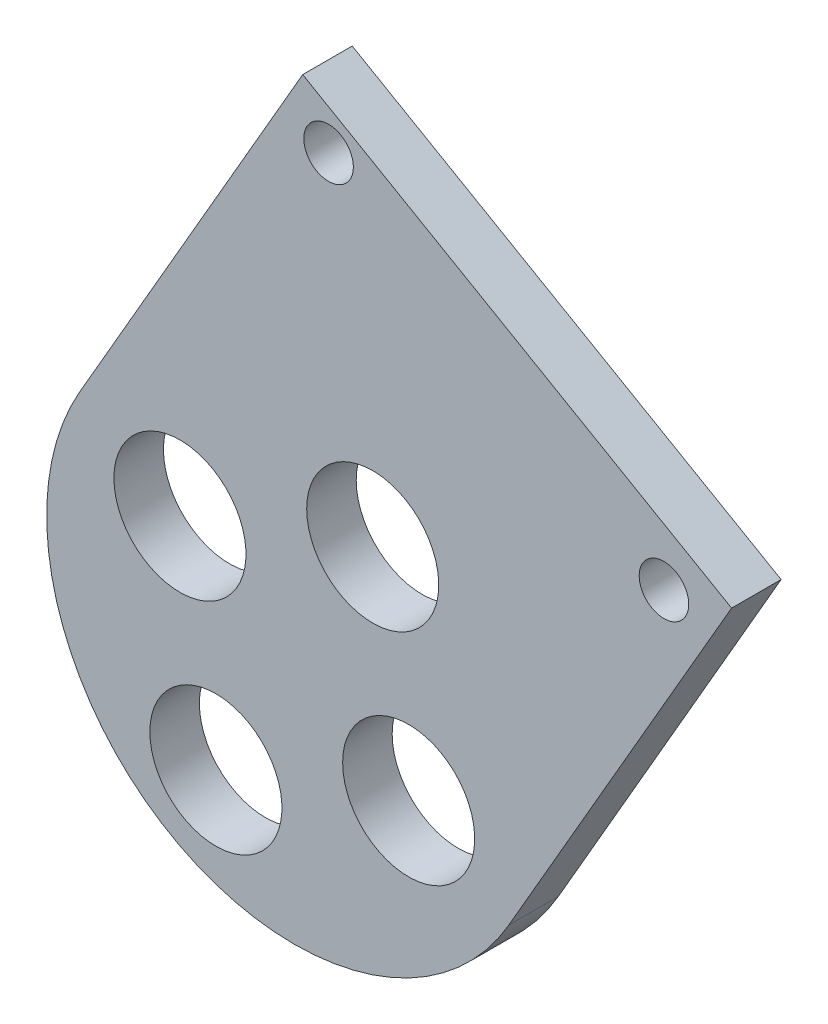
ISO-10303-21;
HEADER;
FILE_DESCRIPTION(('STEP AP214'),'2;1');
FILE_NAME('part.step','',(''),(''),'','','');
FILE_SCHEMA(('AUTOMOTIVE_DESIGN { 1 0 10303 214 1 1 1 1 }'));
ENDSEC;
DATA;
#1=APPLICATION_CONTEXT('core data for automotive mechanical design processes');
#2=APPLICATION_PROTOCOL_DEFINITION('international standard','automotive_design',2000,#1);
#3=PRODUCT_CONTEXT('',#1,'mechanical');
#4=PRODUCT('Part','Part','',(#3));
#5=PRODUCT_RELATED_PRODUCT_CATEGORY('part','',(#4));
#6=PRODUCT_DEFINITION_FORMATION('','',#4);
#7=PRODUCT_DEFINITION_CONTEXT('part definition',#1,'design');
#8=PRODUCT_DEFINITION('design','',#6,#7);
#9=PRODUCT_DEFINITION_SHAPE('','',#8);
#10=(LENGTH_UNIT() NAMED_UNIT(*) SI_UNIT(.MILLI.,.METRE.));
#11=(NAMED_UNIT(*) PLANE_ANGLE_UNIT() SI_UNIT($,.RADIAN.));
#12=(NAMED_UNIT(*) SI_UNIT($,.STERADIAN.) SOLID_ANGLE_UNIT());
#13=UNCERTAINTY_MEASURE_WITH_UNIT(LENGTH_MEASURE(1.E-05),#10,'distance_accuracy_value','');
#14=(GEOMETRIC_REPRESENTATION_CONTEXT(3) GLOBAL_UNCERTAINTY_ASSIGNED_CONTEXT((#13)) GLOBAL_UNIT_ASSIGNED_CONTEXT((#10,
#11,#12)) REPRESENTATION_CONTEXT('',''));
#15=CARTESIAN_POINT('',(0.,0.,0.));
#16=DIRECTION('',(0.,0.,1.));
#17=DIRECTION('',(1.,0.,0.));
#18=AXIS2_PLACEMENT_3D('',#15,#16,#17);
#19=CARTESIAN_POINT('',(-103.641833150661,426.936405577524,-401.357743681072));
#20=DIRECTION('',(0.,0.,-1.));
#21=DIRECTION('',(-1.,0.,0.));
#22=AXIS2_PLACEMENT_3D('',#19,#20,#21);
#23=PLANE('',#22);
#24=CARTESIAN_POINT('',(-145.250000000003,415.751632486842,-401.357743681072));
#25=DIRECTION('',(0.,0.,-1.));
#26=DIRECTION('',(-1.,0.,0.));
#27=AXIS2_PLACEMENT_3D('',#24,#25,#26);
#28=CIRCLE('',#27,4.);
#29=CARTESIAN_POINT('',(-149.250000000003,415.751632486842,-401.357743681072));
#30=VERTEX_POINT('',#29);
#31=EDGE_CURVE('E126',#30,#30,#28,.T.);
#32=ORIENTED_EDGE('',*,*,#31,.T.);
#33=EDGE_LOOP('',(#32));
#34=FACE_BOUND('',#33,.T.);
#35=CARTESIAN_POINT('',(-143.071796769728,403.524391150889,-401.357743681072));
#36=DIRECTION('',(0.,0.,-1.));
#37=DIRECTION('',(-1.,0.,0.));
#38=AXIS2_PLACEMENT_3D('',#35,#36,#37);
#39=CIRCLE('',#38,4.);
#40=CARTESIAN_POINT('',(-147.071796769728,403.524391150889,-401.357743681072));
#41=VERTEX_POINT('',#40);
#42=EDGE_CURVE('E123',#41,#41,#39,.T.);
#43=ORIENTED_EDGE('',*,*,#42,.T.);
#44=EDGE_LOOP('',(#43));
#45=FACE_BOUND('',#44,.T.);
#46=CARTESIAN_POINT('',(-156.928203230279,411.524391150889,-401.357743681072));
#47=DIRECTION('',(0.,0.,-1.));
#48=DIRECTION('',(-1.,0.,0.));
#49=AXIS2_PLACEMENT_3D('',#46,#47,#48);
#50=CIRCLE('',#49,4.);
#51=CARTESIAN_POINT('',(-160.928203230279,411.524391150889,-401.357743681072));
#52=VERTEX_POINT('',#51);
#53=EDGE_CURVE('E120',#52,#52,#50,.T.);
#54=ORIENTED_EDGE('',*,*,#53,.T.);
#55=EDGE_LOOP('',(#54));
#56=FACE_BOUND('',#55,.T.);
#57=CARTESIAN_POINT('',(-154.750000000003,399.297149814937,-401.357743681072));
#58=DIRECTION('',(0.,0.,-1.));
#59=DIRECTION('',(-1.,0.,0.));
#60=AXIS2_PLACEMENT_3D('',#57,#58,#59);
#61=CIRCLE('',#60,4.);
#62=CARTESIAN_POINT('',(-158.750000000003,399.297149814937,-401.357743681072));
#63=VERTEX_POINT('',#62);
#64=EDGE_CURVE('E117',#63,#63,#61,.T.);
#65=ORIENTED_EDGE('',*,*,#64,.T.);
#66=EDGE_LOOP('',(#65));
#67=FACE_BOUND('',#66,.T.);
#68=CARTESIAN_POINT('',(-147.923440835426,435.086734499588,-401.357743681072));
#69=DIRECTION('',(0.,0.,-1.));
#70=DIRECTION('',(-1.,0.,0.));
#71=AXIS2_PLACEMENT_3D('',#68,#69,#70);
#72=CIRCLE('',#71,1.5);
#73=CARTESIAN_POINT('',(-149.423440835426,435.086734499588,-401.357743681072));
#74=VERTEX_POINT('',#73);
#75=EDGE_CURVE('E91',#74,#74,#72,.T.);
#76=ORIENTED_EDGE('',*,*,#75,.T.);
#77=EDGE_LOOP('',(#76));
#78=FACE_BOUND('',#77,.T.);
#79=CARTESIAN_POINT('',(-127.607695154588,422.309000841716,-401.357743681072));
#80=DIRECTION('',(0.,0.,-1.));
#81=DIRECTION('',(-1.,0.,0.));
#82=AXIS2_PLACEMENT_3D('',#79,#80,#81);
#83=CIRCLE('',#82,1.5);
#84=CARTESIAN_POINT('',(-129.107695154588,422.309000841716,-401.357743681072));
#85=VERTEX_POINT('',#84);
#86=EDGE_CURVE('E129',#85,#85,#83,.T.);
#87=ORIENTED_EDGE('',*,*,#86,.T.);
#88=EDGE_LOOP('',(#87));
#89=FACE_BOUND('',#88,.T.);
#90=CARTESIAN_POINT('',(-150.000000000003,407.524391150889,-401.357743681072));
#91=DIRECTION('',(0.,0.,1.));
#92=DIRECTION('',(1.,0.,0.));
#93=AXIS2_PLACEMENT_3D('',#90,#91,#92);
#94=CIRCLE('',#93,15.);
#95=CARTESIAN_POINT('',(-137.009618943236,400.024391150889,-401.357743681072));
#96=VERTEX_POINT('',#95);
#97=CARTESIAN_POINT('',(-162.990381056769,415.024391150889,-401.357743681072));
#98=VERTEX_POINT('',#97);
#99=EDGE_CURVE('E20',#96,#98,#94,.F.);
#100=ORIENTED_EDGE('',*,*,#99,.F.);
#101=DIRECTION('',(-0.5,-0.866025403784438,0.));
#102=VECTOR('',#101,1.);
#103=CARTESIAN_POINT('',(-137.009618943236,400.024391150889,-401.357743681072));
#104=LINE('',#103,#102);
#105=CARTESIAN_POINT('',(-123.509618943236,423.407077053069,-401.357743681072));
#106=VERTEX_POINT('',#105);
#107=EDGE_CURVE('E67',#96,#106,#104,.F.);
#108=ORIENTED_EDGE('',*,*,#107,.T.);
#109=DIRECTION('',(0.866025403784438,-0.5,0.));
#110=VECTOR('',#109,1.);
#111=CARTESIAN_POINT('',(-123.509618943236,423.407077053069,-401.357743681072));
#112=LINE('',#111,#110);
#113=CARTESIAN_POINT('',(-149.490381056769,438.407077053069,-401.357743681072));
#114=VERTEX_POINT('',#113);
#115=EDGE_CURVE('E58',#106,#114,#112,.F.);
#116=ORIENTED_EDGE('',*,*,#115,.T.);
#117=DIRECTION('',(0.5,0.866025403784438,0.));
#118=VECTOR('',#117,1.);
#119=CARTESIAN_POINT('',(-162.990381056769,415.024391150889,-401.357743681072));
#120=LINE('',#119,#118);
#121=EDGE_CURVE('E56',#114,#98,#120,.F.);
#122=ORIENTED_EDGE('',*,*,#121,.T.);
#123=EDGE_LOOP('',(#100,#108,#116,#122));
#124=FACE_BOUND('',#123,.T.);
#125=ADVANCED_FACE('F17',(#34,#45,#56,#67,#78,#89,#124),#23,.F.);
#126=CARTESIAN_POINT('',(-137.009618943236,400.024391150889,-404.357743681072));
#127=DIRECTION('',(-0.866025403784438,0.5,0.));
#128=DIRECTION('',(-0.5,-0.866025403784438,0.));
#129=AXIS2_PLACEMENT_3D('',#126,#127,#128);
#130=PLANE('',#129);
#131=DIRECTION('',(0.,0.,1.));
#132=VECTOR('',#131,1.);
#133=CARTESIAN_POINT('',(-137.009618943236,400.024391150889,-402.857743681072));
#134=LINE('',#133,#132);
#135=CARTESIAN_POINT('',(-137.009618943236,400.024391150889,-404.357743681072));
#136=VERTEX_POINT('',#135);
#137=EDGE_CURVE('E61',#136,#96,#134,.T.);
#138=ORIENTED_EDGE('',*,*,#137,.F.);
#139=DIRECTION('',(-0.499999999999999,-0.866025403784439,0.));
#140=VECTOR('',#139,1.);
#141=CARTESIAN_POINT('',(-123.509618943236,423.407077053069,-404.357743681072));
#142=LINE('',#141,#140);
#143=CARTESIAN_POINT('',(-123.509618943236,423.407077053069,-404.357743681072));
#144=VERTEX_POINT('',#143);
#145=EDGE_CURVE('E116',#144,#136,#142,.T.);
#146=ORIENTED_EDGE('',*,*,#145,.F.);
#147=DIRECTION('',(0.,0.,1.));
#148=VECTOR('',#147,1.);
#149=CARTESIAN_POINT('',(-123.509618943236,423.407077053069,-404.357743681072));
#150=LINE('',#149,#148);
#151=EDGE_CURVE('E85',#144,#106,#150,.T.);
#152=ORIENTED_EDGE('',*,*,#151,.T.);
#153=ORIENTED_EDGE('',*,*,#107,.F.);
#154=EDGE_LOOP('',(#138,#146,#152,#153));
#155=FACE_BOUND('',#154,.T.);
#156=ADVANCED_FACE('F157',(#155),#130,.F.);
#157=CARTESIAN_POINT('',(-150.000000000003,407.524391150889,-402.857743681072));
#158=DIRECTION('',(0.,0.,1.));
#159=DIRECTION('',(1.,0.,0.));
#160=AXIS2_PLACEMENT_3D('',#157,#158,#159);
#161=CYLINDRICAL_SURFACE('',#160,15.);
#162=CARTESIAN_POINT('',(-150.000000000003,407.524391150889,-404.357743681072));
#163=DIRECTION('',(0.,0.,1.));
#164=DIRECTION('',(1.,0.,0.));
#165=AXIS2_PLACEMENT_3D('',#162,#163,#164);
#166=CIRCLE('',#165,15.);
#167=CARTESIAN_POINT('',(-162.990381056769,415.024391150889,-404.357743681072));
#168=VERTEX_POINT('',#167);
#169=EDGE_CURVE('E114',#136,#168,#166,.F.);
#170=ORIENTED_EDGE('',*,*,#169,.F.);
#171=ORIENTED_EDGE('',*,*,#137,.T.);
#172=ORIENTED_EDGE('',*,*,#99,.T.);
#173=DIRECTION('',(0.,0.,1.));
#174=VECTOR('',#173,1.);
#175=CARTESIAN_POINT('',(-162.990381056769,415.024391150889,-401.357743681072));
#176=LINE('',#175,#174);
#177=EDGE_CURVE('E60',#98,#168,#176,.F.);
#178=ORIENTED_EDGE('',*,*,#177,.T.);
#179=EDGE_LOOP('',(#170,#171,#172,#178));
#180=FACE_BOUND('',#179,.T.);
#181=ADVANCED_FACE('F66',(#180),#161,.T.);
#182=CARTESIAN_POINT('',(-162.990381056769,415.024391150889,-401.357743681072));
#183=DIRECTION('',(0.866025403784438,-0.5,0.));
#184=DIRECTION('',(0.5,0.866025403784438,0.));
#185=AXIS2_PLACEMENT_3D('',#182,#183,#184);
#186=PLANE('',#185);
#187=ORIENTED_EDGE('',*,*,#177,.F.);
#188=ORIENTED_EDGE('',*,*,#121,.F.);
#189=DIRECTION('',(0.,0.,1.));
#190=VECTOR('',#189,1.);
#191=CARTESIAN_POINT('',(-149.490381056769,438.407077053069,-404.357743681072));
#192=LINE('',#191,#190);
#193=CARTESIAN_POINT('',(-149.490381056769,438.407077053069,-404.357743681072));
#194=VERTEX_POINT('',#193);
#195=EDGE_CURVE('E35',#114,#194,#192,.F.);
#196=ORIENTED_EDGE('',*,*,#195,.T.);
#197=DIRECTION('',(0.499999999999998,0.86602540378444,0.));
#198=VECTOR('',#197,1.);
#199=CARTESIAN_POINT('',(-162.990381056769,415.024391150889,-404.357743681072));
#200=LINE('',#199,#198);
#201=EDGE_CURVE('E70',#168,#194,#200,.T.);
#202=ORIENTED_EDGE('',*,*,#201,.F.);
#203=EDGE_LOOP('',(#187,#188,#196,#202));
#204=FACE_BOUND('',#203,.T.);
#205=ADVANCED_FACE('F68',(#204),#186,.F.);
#206=CARTESIAN_POINT('',(-123.509618943236,423.407077053069,-404.357743681072));
#207=DIRECTION('',(-0.5,-0.866025403784438,0.));
#208=DIRECTION('',(0.866025403784438,-0.5,0.));
#209=AXIS2_PLACEMENT_3D('',#206,#207,#208);
#210=PLANE('',#209);
#211=DIRECTION('',(0.866025403784437,-0.500000000000003,0.));
#212=VECTOR('',#211,1.);
#213=CARTESIAN_POINT('',(-149.490381056769,438.407077053069,-404.357743681072));
#214=LINE('',#213,#212);
#215=EDGE_CURVE('E78',#194,#144,#214,.T.);
#216=ORIENTED_EDGE('',*,*,#215,.F.);
#217=ORIENTED_EDGE('',*,*,#195,.F.);
#218=ORIENTED_EDGE('',*,*,#115,.F.);
#219=ORIENTED_EDGE('',*,*,#151,.F.);
#220=EDGE_LOOP('',(#216,#217,#218,#219));
#221=FACE_BOUND('',#220,.T.);
#222=ADVANCED_FACE('F140',(#221),#210,.F.);
#223=CARTESIAN_POINT('',(-147.923440835426,435.086734499588,-404.659227586513));
#224=DIRECTION('',(0.,0.,-1.));
#225=DIRECTION('',(-1.,0.,0.));
#226=AXIS2_PLACEMENT_3D('',#223,#224,#225);
#227=CYLINDRICAL_SURFACE('',#226,1.5);
#228=ORIENTED_EDGE('',*,*,#75,.F.);
#229=EDGE_LOOP('',(#228));
#230=FACE_BOUND('',#229,.T.);
#231=CARTESIAN_POINT('',(-147.923440835426,435.086734499588,-404.357743681072));
#232=DIRECTION('',(0.,0.,-1.));
#233=DIRECTION('',(-1.,0.,0.));
#234=AXIS2_PLACEMENT_3D('',#231,#232,#233);
#235=CIRCLE('',#234,1.5);
#236=CARTESIAN_POINT('',(-149.423440835426,435.086734499588,-404.357743681072));
#237=VERTEX_POINT('',#236);
#238=EDGE_CURVE('E81',#237,#237,#235,.F.);
#239=ORIENTED_EDGE('',*,*,#238,.F.);
#240=EDGE_LOOP('',(#239));
#241=FACE_BOUND('',#240,.T.);
#242=ADVANCED_FACE('F136',(#230,#241),#227,.F.);
#243=CARTESIAN_POINT('',(-127.607695154588,422.309000841716,-404.659227586513));
#244=DIRECTION('',(0.,0.,-1.));
#245=DIRECTION('',(-1.,0.,0.));
#246=AXIS2_PLACEMENT_3D('',#243,#244,#245);
#247=CYLINDRICAL_SURFACE('',#246,1.5);
#248=ORIENTED_EDGE('',*,*,#86,.F.);
#249=EDGE_LOOP('',(#248));
#250=FACE_BOUND('',#249,.T.);
#251=CARTESIAN_POINT('',(-127.607695154588,422.309000841716,-404.357743681072));
#252=DIRECTION('',(0.,0.,-1.));
#253=DIRECTION('',(-1.,0.,0.));
#254=AXIS2_PLACEMENT_3D('',#251,#252,#253);
#255=CIRCLE('',#254,1.5);
#256=CARTESIAN_POINT('',(-129.107695154588,422.309000841716,-404.357743681072));
#257=VERTEX_POINT('',#256);
#258=EDGE_CURVE('E109',#257,#257,#255,.F.);
#259=ORIENTED_EDGE('',*,*,#258,.F.);
#260=EDGE_LOOP('',(#259));
#261=FACE_BOUND('',#260,.T.);
#262=ADVANCED_FACE('F139',(#250,#261),#247,.F.);
#263=CARTESIAN_POINT('',(-145.250000000003,415.751632486842,-403.607743681072));
#264=DIRECTION('',(0.,0.,-1.));
#265=DIRECTION('',(-1.,0.,0.));
#266=AXIS2_PLACEMENT_3D('',#263,#264,#265);
#267=CYLINDRICAL_SURFACE('',#266,4.);
#268=ORIENTED_EDGE('',*,*,#31,.F.);
#269=EDGE_LOOP('',(#268));
#270=FACE_BOUND('',#269,.T.);
#271=CARTESIAN_POINT('',(-145.250000000003,415.751632486842,-404.357743681072));
#272=DIRECTION('',(0.,0.,-1.));
#273=DIRECTION('',(-1.,0.,0.));
#274=AXIS2_PLACEMENT_3D('',#271,#272,#273);
#275=CIRCLE('',#274,4.);
#276=CARTESIAN_POINT('',(-149.250000000003,415.751632486842,-404.357743681072));
#277=VERTEX_POINT('',#276);
#278=EDGE_CURVE('E106',#277,#277,#275,.F.);
#279=ORIENTED_EDGE('',*,*,#278,.F.);
#280=EDGE_LOOP('',(#279));
#281=FACE_BOUND('',#280,.T.);
#282=ADVANCED_FACE('F199',(#270,#281),#267,.F.);
#283=CARTESIAN_POINT('',(-143.071796769728,403.524391150889,-403.607743681072));
#284=DIRECTION('',(0.,0.,-1.));
#285=DIRECTION('',(-1.,0.,0.));
#286=AXIS2_PLACEMENT_3D('',#283,#284,#285);
#287=CYLINDRICAL_SURFACE('',#286,4.);
#288=ORIENTED_EDGE('',*,*,#42,.F.);
#289=EDGE_LOOP('',(#288));
#290=FACE_BOUND('',#289,.T.);
#291=CARTESIAN_POINT('',(-143.071796769728,403.524391150889,-404.357743681072));
#292=DIRECTION('',(0.,0.,-1.));
#293=DIRECTION('',(-1.,0.,0.));
#294=AXIS2_PLACEMENT_3D('',#291,#292,#293);
#295=CIRCLE('',#294,4.);
#296=CARTESIAN_POINT('',(-147.071796769728,403.524391150889,-404.357743681072));
#297=VERTEX_POINT('',#296);
#298=EDGE_CURVE('E103',#297,#297,#295,.F.);
#299=ORIENTED_EDGE('',*,*,#298,.F.);
#300=EDGE_LOOP('',(#299));
#301=FACE_BOUND('',#300,.T.);
#302=ADVANCED_FACE('F204',(#290,#301),#287,.F.);
#303=CARTESIAN_POINT('',(-156.928203230279,411.524391150889,-403.607743681072));
#304=DIRECTION('',(0.,0.,-1.));
#305=DIRECTION('',(-1.,0.,0.));
#306=AXIS2_PLACEMENT_3D('',#303,#304,#305);
#307=CYLINDRICAL_SURFACE('',#306,4.);
#308=ORIENTED_EDGE('',*,*,#53,.F.);
#309=EDGE_LOOP('',(#308));
#310=FACE_BOUND('',#309,.T.);
#311=CARTESIAN_POINT('',(-156.928203230279,411.524391150889,-404.357743681072));
#312=DIRECTION('',(0.,0.,-1.));
#313=DIRECTION('',(-1.,0.,0.));
#314=AXIS2_PLACEMENT_3D('',#311,#312,#313);
#315=CIRCLE('',#314,4.);
#316=CARTESIAN_POINT('',(-160.928203230279,411.524391150889,-404.357743681072));
#317=VERTEX_POINT('',#316);
#318=EDGE_CURVE('E26',#317,#317,#315,.F.);
#319=ORIENTED_EDGE('',*,*,#318,.F.);
#320=EDGE_LOOP('',(#319));
#321=FACE_BOUND('',#320,.T.);
#322=ADVANCED_FACE('F186',(#310,#321),#307,.F.);
#323=CARTESIAN_POINT('',(-154.750000000003,399.297149814937,-403.607743681072));
#324=DIRECTION('',(0.,0.,-1.));
#325=DIRECTION('',(-1.,0.,0.));
#326=AXIS2_PLACEMENT_3D('',#323,#324,#325);
#327=CYLINDRICAL_SURFACE('',#326,4.);
#328=ORIENTED_EDGE('',*,*,#64,.F.);
#329=EDGE_LOOP('',(#328));
#330=FACE_BOUND('',#329,.T.);
#331=CARTESIAN_POINT('',(-154.750000000003,399.297149814937,-404.357743681072));
#332=DIRECTION('',(0.,0.,-1.));
#333=DIRECTION('',(-1.,0.,0.));
#334=AXIS2_PLACEMENT_3D('',#331,#332,#333);
#335=CIRCLE('',#334,4.);
#336=CARTESIAN_POINT('',(-158.750000000003,399.297149814937,-404.357743681072));
#337=VERTEX_POINT('',#336);
#338=EDGE_CURVE('E11',#337,#337,#335,.F.);
#339=ORIENTED_EDGE('',*,*,#338,.F.);
#340=EDGE_LOOP('',(#339));
#341=FACE_BOUND('',#340,.T.);
#342=ADVANCED_FACE('F147',(#330,#341),#327,.F.);
#343=CARTESIAN_POINT('',(-103.641833150661,426.936405577524,-404.357743681072));
#344=DIRECTION('',(0.,0.,-1.));
#345=DIRECTION('',(-1.,0.,0.));
#346=AXIS2_PLACEMENT_3D('',#343,#344,#345);
#347=PLANE('',#346);
#348=ORIENTED_EDGE('',*,*,#338,.T.);
#349=EDGE_LOOP('',(#348));
#350=FACE_BOUND('',#349,.T.);
#351=ORIENTED_EDGE('',*,*,#318,.T.);
#352=EDGE_LOOP('',(#351));
#353=FACE_BOUND('',#352,.T.);
#354=ORIENTED_EDGE('',*,*,#298,.T.);
#355=EDGE_LOOP('',(#354));
#356=FACE_BOUND('',#355,.T.);
#357=ORIENTED_EDGE('',*,*,#278,.T.);
#358=EDGE_LOOP('',(#357));
#359=FACE_BOUND('',#358,.T.);
#360=ORIENTED_EDGE('',*,*,#258,.T.);
#361=EDGE_LOOP('',(#360));
#362=FACE_BOUND('',#361,.T.);
#363=ORIENTED_EDGE('',*,*,#238,.T.);
#364=EDGE_LOOP('',(#363));
#365=FACE_BOUND('',#364,.T.);
#366=ORIENTED_EDGE('',*,*,#201,.T.);
#367=ORIENTED_EDGE('',*,*,#215,.T.);
#368=ORIENTED_EDGE('',*,*,#145,.T.);
#369=ORIENTED_EDGE('',*,*,#169,.T.);
#370=EDGE_LOOP('',(#366,#367,#368,#369));
#371=FACE_BOUND('',#370,.T.);
#372=ADVANCED_FACE('F144',(#350,#353,#356,#359,#362,#365,#371),#347,.T.);
#373=CLOSED_SHELL('',(#125,#156,#181,#205,#222,#242,#262,#282,#302,#322,#342,#372));
#374=MANIFOLD_SOLID_BREP('B1',#373);
#375=ADVANCED_BREP_SHAPE_REPRESENTATION('',(#18,#374),#14);
#376=SHAPE_DEFINITION_REPRESENTATION(#9,#375);
ENDSEC;
END-ISO-10303-21;
